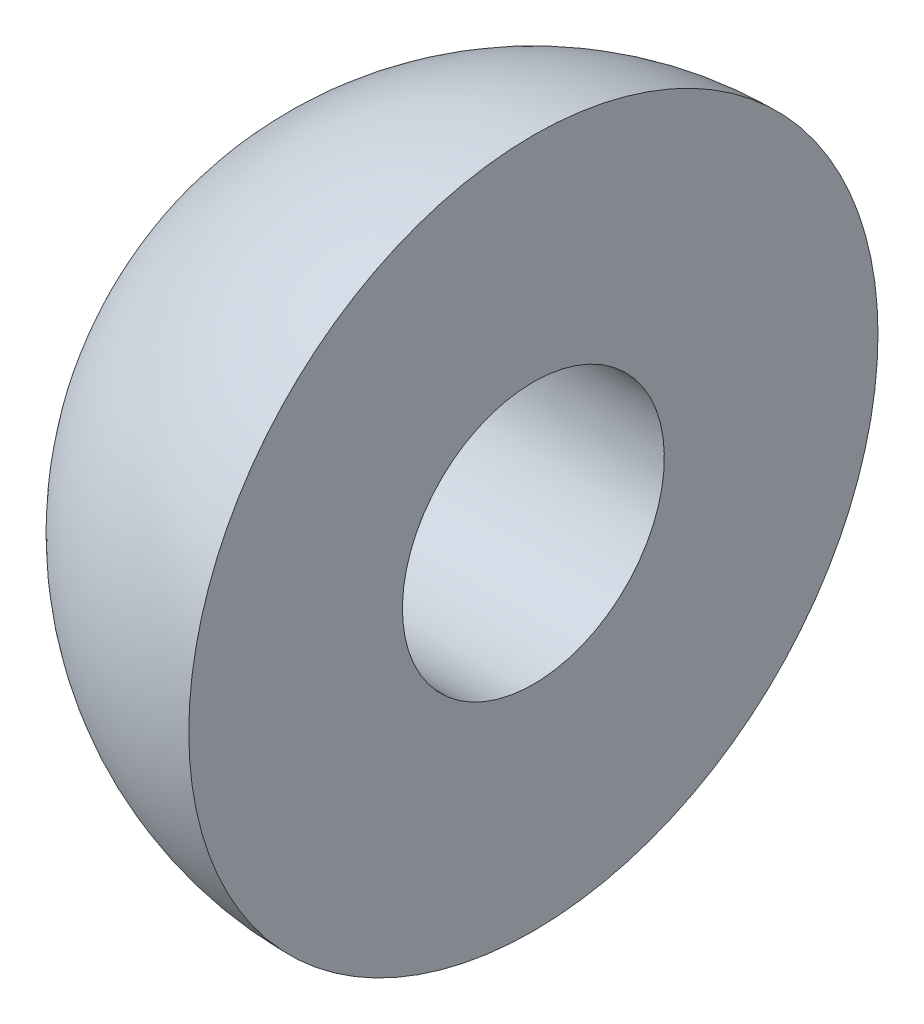
ISO-10303-21;
HEADER;
FILE_DESCRIPTION(('STEP AP214'),'2;1');
FILE_NAME('part.step','',(''),(''),'','','');
FILE_SCHEMA(('AUTOMOTIVE_DESIGN { 1 0 10303 214 1 1 1 1 }'));
ENDSEC;
DATA;
#1=APPLICATION_CONTEXT('core data for automotive mechanical design processes');
#2=APPLICATION_PROTOCOL_DEFINITION('international standard','automotive_design',2000,#1);
#3=PRODUCT_CONTEXT('',#1,'mechanical');
#4=PRODUCT('Part','Part','',(#3));
#5=PRODUCT_RELATED_PRODUCT_CATEGORY('part','',(#4));
#6=PRODUCT_DEFINITION_FORMATION('','',#4);
#7=PRODUCT_DEFINITION_CONTEXT('part definition',#1,'design');
#8=PRODUCT_DEFINITION('design','',#6,#7);
#9=PRODUCT_DEFINITION_SHAPE('','',#8);
#10=(LENGTH_UNIT() NAMED_UNIT(*) SI_UNIT(.MILLI.,.METRE.));
#11=(NAMED_UNIT(*) PLANE_ANGLE_UNIT() SI_UNIT($,.RADIAN.));
#12=(NAMED_UNIT(*) SI_UNIT($,.STERADIAN.) SOLID_ANGLE_UNIT());
#13=UNCERTAINTY_MEASURE_WITH_UNIT(LENGTH_MEASURE(1.E-05),#10,'distance_accuracy_value','');
#14=(GEOMETRIC_REPRESENTATION_CONTEXT(3) GLOBAL_UNCERTAINTY_ASSIGNED_CONTEXT((#13)) GLOBAL_UNIT_ASSIGNED_CONTEXT((#10,
#11,#12)) REPRESENTATION_CONTEXT('',''));
#15=CARTESIAN_POINT('',(0.,0.,0.));
#16=DIRECTION('',(0.,0.,1.));
#17=DIRECTION('',(1.,0.,0.));
#18=AXIS2_PLACEMENT_3D('',#15,#16,#17);
#19=CARTESIAN_POINT('',(0.,0.,0.));
#20=DIRECTION('',(0.,0.,1.));
#21=DIRECTION('',(0.,-1.,0.));
#22=AXIS2_PLACEMENT_3D('',#19,#20,#21);
#23=SPHERICAL_SURFACE('',#22,2.5);
#24=CARTESIAN_POINT('',(0.,0.,0.));
#25=DIRECTION('',(1.,0.,0.));
#26=DIRECTION('',(0.,1.,0.));
#27=AXIS2_PLACEMENT_3D('',#24,#25,#26);
#28=SPHERICAL_SURFACE('',#27,2.5);
#29=CARTESIAN_POINT('',(-2.31246621596944,0.,0.));
#30=DIRECTION('',(1.,0.,0.));
#31=DIRECTION('',(0.,1.,0.));
#32=AXIS2_PLACEMENT_3D('',#29,#30,#31);
#33=CIRCLE('',#32,0.95);
#34=CARTESIAN_POINT('',(-2.31246621596943,0.950000000000016,0.));
#35=VERTEX_POINT('',#34);
#36=EDGE_CURVE('E39',#35,#35,#33,.F.);
#37=ORIENTED_EDGE('',*,*,#36,.F.);
#38=EDGE_LOOP('',(#37));
#39=FACE_BOUND('',#38,.T.);
#40=CARTESIAN_POINT('',(0.,0.,0.));
#41=DIRECTION('',(-1.,0.,0.));
#42=DIRECTION('',(0.,0.,-1.));
#43=AXIS2_PLACEMENT_3D('',#40,#41,#42);
#44=CIRCLE('',#43,2.5);
#45=CARTESIAN_POINT('',(0.,0.,-2.5));
#46=VERTEX_POINT('',#45);
#47=EDGE_CURVE('E10',#46,#46,#44,.T.);
#48=ORIENTED_EDGE('',*,*,#47,.T.);
#49=EDGE_LOOP('',(#48));
#50=FACE_BOUND('',#49,.T.);
#51=ADVANCED_FACE('F33',(#39,#50),#28,.T.);
#52=CARTESIAN_POINT('',(0.,0.,0.));
#53=DIRECTION('',(-1.,0.,0.));
#54=DIRECTION('',(0.,0.,-1.));
#55=AXIS2_PLACEMENT_3D('',#52,#53,#54);
#56=PLANE('',#55);
#57=CARTESIAN_POINT('',(0.,0.,0.));
#58=DIRECTION('',(1.,0.,0.));
#59=DIRECTION('',(0.,1.,0.));
#60=AXIS2_PLACEMENT_3D('',#57,#58,#59);
#61=CIRCLE('',#60,0.95);
#62=CARTESIAN_POINT('',(0.,0.95,0.));
#63=VERTEX_POINT('',#62);
#64=EDGE_CURVE('E43',#63,#63,#61,.T.);
#65=ORIENTED_EDGE('',*,*,#64,.F.);
#66=EDGE_LOOP('',(#65));
#67=FACE_BOUND('',#66,.T.);
#68=ORIENTED_EDGE('',*,*,#47,.F.);
#69=EDGE_LOOP('',(#68));
#70=FACE_BOUND('',#69,.T.);
#71=ADVANCED_FACE('F52',(#67,#70),#56,.F.);
#72=CARTESIAN_POINT('',(-2.50000000000002,0.,0.));
#73=DIRECTION('',(1.,0.,0.));
#74=DIRECTION('',(0.,1.,0.));
#75=AXIS2_PLACEMENT_3D('',#72,#73,#74);
#76=CYLINDRICAL_SURFACE('',#75,0.95);
#77=ORIENTED_EDGE('',*,*,#36,.T.);
#78=EDGE_LOOP('',(#77));
#79=FACE_BOUND('',#78,.T.);
#80=ORIENTED_EDGE('',*,*,#64,.T.);
#81=EDGE_LOOP('',(#80));
#82=FACE_BOUND('',#81,.T.);
#83=ADVANCED_FACE('F50',(#79,#82),#76,.F.);
#84=CLOSED_SHELL('',(#51,#71,#83));
#85=MANIFOLD_SOLID_BREP('B2',#84);
#86=ADVANCED_BREP_SHAPE_REPRESENTATION('',(#18,#85),#14);
#87=SHAPE_DEFINITION_REPRESENTATION(#9,#86);
ENDSEC;
END-ISO-10303-21;
